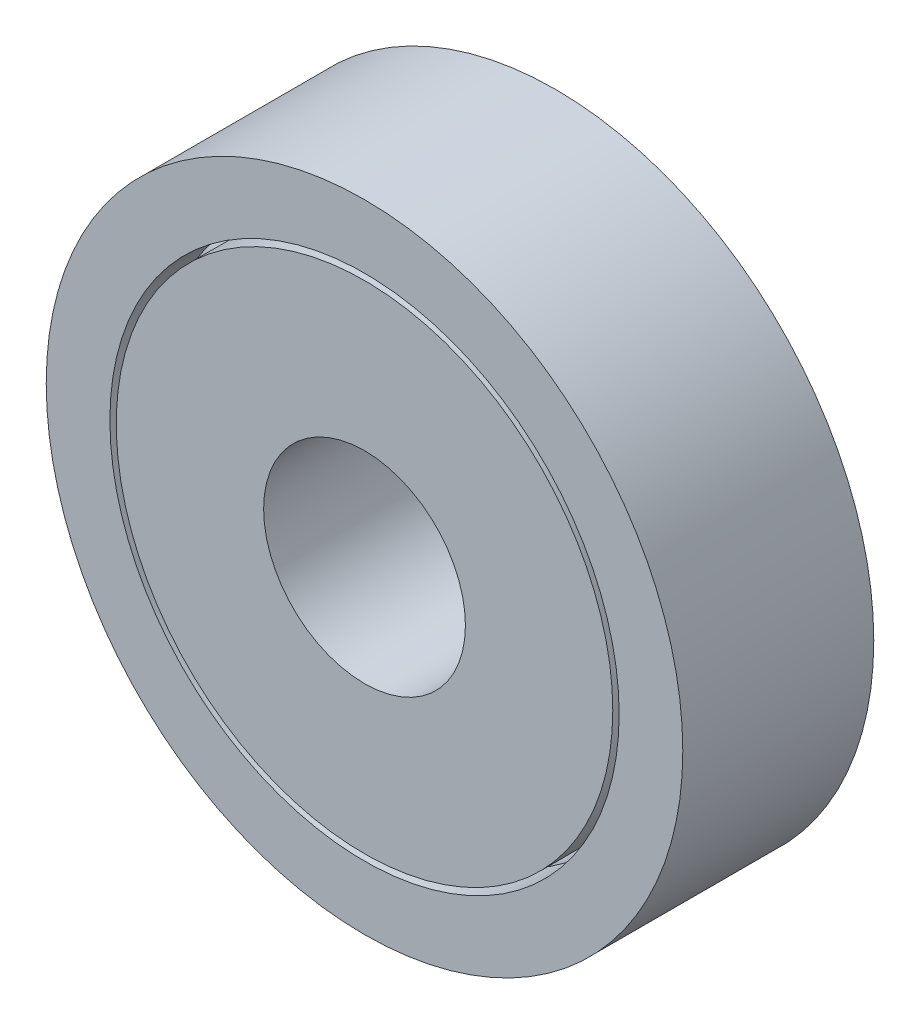
ISO-10303-21;
HEADER;
FILE_DESCRIPTION(('STEP AP214'),'2;1');
FILE_NAME('part.step','',(''),(''),'','','');
FILE_SCHEMA(('AUTOMOTIVE_DESIGN { 1 0 10303 214 1 1 1 1 }'));
ENDSEC;
DATA;
#1=APPLICATION_CONTEXT('core data for automotive mechanical design processes');
#2=APPLICATION_PROTOCOL_DEFINITION('international standard','automotive_design',2000,#1);
#3=PRODUCT_CONTEXT('',#1,'mechanical');
#4=PRODUCT('Part','Part','',(#3));
#5=PRODUCT_RELATED_PRODUCT_CATEGORY('part','',(#4));
#6=PRODUCT_DEFINITION_FORMATION('','',#4);
#7=PRODUCT_DEFINITION_CONTEXT('part definition',#1,'design');
#8=PRODUCT_DEFINITION('design','',#6,#7);
#9=PRODUCT_DEFINITION_SHAPE('','',#8);
#10=(LENGTH_UNIT() NAMED_UNIT(*) SI_UNIT(.MILLI.,.METRE.));
#11=(NAMED_UNIT(*) PLANE_ANGLE_UNIT() SI_UNIT($,.RADIAN.));
#12=(NAMED_UNIT(*) SI_UNIT($,.STERADIAN.) SOLID_ANGLE_UNIT());
#13=UNCERTAINTY_MEASURE_WITH_UNIT(LENGTH_MEASURE(1.E-05),#10,'distance_accuracy_value','');
#14=(GEOMETRIC_REPRESENTATION_CONTEXT(3) GLOBAL_UNCERTAINTY_ASSIGNED_CONTEXT((#13)) GLOBAL_UNIT_ASSIGNED_CONTEXT((#10,
#11,#12)) REPRESENTATION_CONTEXT('',''));
#15=CARTESIAN_POINT('',(0.,0.,0.));
#16=DIRECTION('',(0.,0.,1.));
#17=DIRECTION('',(1.,0.,0.));
#18=AXIS2_PLACEMENT_3D('',#15,#16,#17);
#19=CARTESIAN_POINT('',(3.72988891762,1.44496666475,1.5));
#20=DIRECTION('',(-0.645132887593961,-0.764070387689954,0.));
#21=DIRECTION('',(0.764070387689954,-0.645132887593961,0.));
#22=AXIS2_PLACEMENT_3D('',#19,#20,#21);
#23=SPHERICAL_SURFACE('',#22,0.7);
#24=CARTESIAN_POINT('',(3.27829589630423,0.910117393367032,1.5));
#25=VERTEX_POINT('',#24);
#26=VERTEX_LOOP('',#25);
#27=FACE_BOUND('',#26,.T.);
#28=ADVANCED_FACE('P0_F13',(#27),#23,.T.);
#29=CLOSED_SHELL('',(#28));
#30=MANIFOLD_SOLID_BREP('P0_B1',#29);
#31=CARTESIAN_POINT('',(0.,0.,1.5));
#32=DIRECTION('',(0.,0.,1.));
#33=DIRECTION('',(1.,0.,0.));
#34=AXIS2_PLACEMENT_3D('',#31,#32,#33);
#35=CYLINDRICAL_SURFACE('',#34,3.9);
#36=CARTESIAN_POINT('',(0.,0.,3.));
#37=DIRECTION('',(0.,0.,1.));
#38=DIRECTION('',(1.,0.,0.));
#39=AXIS2_PLACEMENT_3D('',#36,#37,#38);
#40=CIRCLE('',#39,3.9);
#41=CARTESIAN_POINT('',(3.9,0.,3.));
#42=VERTEX_POINT('',#41);
#43=EDGE_CURVE('P1_E19',#42,#42,#40,.T.);
#44=ORIENTED_EDGE('',*,*,#43,.F.);
#45=EDGE_LOOP('',(#44));
#46=FACE_BOUND('',#45,.T.);
#47=CARTESIAN_POINT('',(0.,0.,2.243303437366));
#48=DIRECTION('',(0.,0.,1.));
#49=DIRECTION('',(0.,-1.,0.));
#50=AXIS2_PLACEMENT_3D('',#47,#48,#49);
#51=CIRCLE('',#50,3.90000000000054);
#52=CARTESIAN_POINT('',(0.,-3.90000000000054,2.243303437366));
#53=VERTEX_POINT('',#52);
#54=EDGE_CURVE('P1_E31',#53,#53,#51,.T.);
#55=ORIENTED_EDGE('',*,*,#54,.T.);
#56=EDGE_LOOP('',(#55));
#57=FACE_BOUND('',#56,.T.);
#58=ADVANCED_FACE('P1_F15',(#46,#57),#35,.T.);
#59=CARTESIAN_POINT('',(0.,0.,3.));
#60=DIRECTION('',(0.,0.,1.));
#61=DIRECTION('',(1.,0.,0.));
#62=AXIS2_PLACEMENT_3D('',#59,#60,#61);
#63=PLANE('',#62);
#64=ORIENTED_EDGE('',*,*,#43,.T.);
#65=EDGE_LOOP('',(#64));
#66=FACE_BOUND('',#65,.T.);
#67=CARTESIAN_POINT('',(0.,0.,3.));
#68=DIRECTION('',(0.,0.,1.));
#69=DIRECTION('',(1.,0.,0.));
#70=AXIS2_PLACEMENT_3D('',#67,#68,#69);
#71=CIRCLE('',#70,1.585);
#72=CARTESIAN_POINT('',(1.585,0.,3.));
#73=VERTEX_POINT('',#72);
#74=EDGE_CURVE('P1_E33',#73,#73,#71,.F.);
#75=ORIENTED_EDGE('',*,*,#74,.T.);
#76=EDGE_LOOP('',(#75));
#77=FACE_BOUND('',#76,.T.);
#78=ADVANCED_FACE('P1_F44',(#66,#77),#63,.T.);
#79=CARTESIAN_POINT('',(0.,0.,1.5));
#80=DIRECTION('',(0.,0.,1.));
#81=DIRECTION('',(0.,-1.,0.));
#82=AXIS2_PLACEMENT_3D('',#79,#80,#81);
#83=TOROIDAL_SURFACE('',#82,4.,0.75);
#84=ORIENTED_EDGE('',*,*,#54,.F.);
#85=EDGE_LOOP('',(#84));
#86=FACE_BOUND('',#85,.T.);
#87=CARTESIAN_POINT('',(0.,0.,0.756696562634));
#88=DIRECTION('',(0.,0.,1.));
#89=DIRECTION('',(1.,0.,0.));
#90=AXIS2_PLACEMENT_3D('',#87,#88,#89);
#91=CIRCLE('',#90,3.9);
#92=CARTESIAN_POINT('',(3.9,0.,0.756696562634));
#93=VERTEX_POINT('',#92);
#94=EDGE_CURVE('P1_E28',#93,#93,#91,.F.);
#95=ORIENTED_EDGE('',*,*,#94,.F.);
#96=EDGE_LOOP('',(#95));
#97=FACE_BOUND('',#96,.T.);
#98=ADVANCED_FACE('P1_F17',(#86,#97),#83,.F.);
#99=CARTESIAN_POINT('',(0.,0.,1.5));
#100=DIRECTION('',(0.,0.,1.));
#101=DIRECTION('',(1.,0.,0.));
#102=AXIS2_PLACEMENT_3D('',#99,#100,#101);
#103=CYLINDRICAL_SURFACE('',#102,1.585);
#104=ORIENTED_EDGE('',*,*,#74,.F.);
#105=EDGE_LOOP('',(#104));
#106=FACE_BOUND('',#105,.T.);
#107=CARTESIAN_POINT('',(0.,0.,0.));
#108=DIRECTION('',(0.,0.,1.));
#109=DIRECTION('',(1.,0.,0.));
#110=AXIS2_PLACEMENT_3D('',#107,#108,#109);
#111=CIRCLE('',#110,1.585);
#112=CARTESIAN_POINT('',(1.585,0.,0.));
#113=VERTEX_POINT('',#112);
#114=EDGE_CURVE('P1_E23',#113,#113,#111,.F.);
#115=ORIENTED_EDGE('',*,*,#114,.T.);
#116=EDGE_LOOP('',(#115));
#117=FACE_BOUND('',#116,.T.);
#118=ADVANCED_FACE('P1_F60',(#106,#117),#103,.F.);
#119=CARTESIAN_POINT('',(0.,0.,1.5));
#120=DIRECTION('',(0.,0.,1.));
#121=DIRECTION('',(1.,0.,0.));
#122=AXIS2_PLACEMENT_3D('',#119,#120,#121);
#123=CYLINDRICAL_SURFACE('',#122,3.9);
#124=ORIENTED_EDGE('',*,*,#94,.T.);
#125=EDGE_LOOP('',(#124));
#126=FACE_BOUND('',#125,.T.);
#127=CARTESIAN_POINT('',(0.,0.,0.));
#128=DIRECTION('',(0.,0.,1.));
#129=DIRECTION('',(1.,0.,0.));
#130=AXIS2_PLACEMENT_3D('',#127,#128,#129);
#131=CIRCLE('',#130,3.9);
#132=CARTESIAN_POINT('',(3.9,0.,0.));
#133=VERTEX_POINT('',#132);
#134=EDGE_CURVE('P1_E10',#133,#133,#131,.T.);
#135=ORIENTED_EDGE('',*,*,#134,.T.);
#136=EDGE_LOOP('',(#135));
#137=FACE_BOUND('',#136,.T.);
#138=ADVANCED_FACE('P1_F54',(#126,#137),#123,.T.);
#139=CARTESIAN_POINT('',(0.,0.,0.));
#140=DIRECTION('',(0.,0.,1.));
#141=DIRECTION('',(1.,0.,0.));
#142=AXIS2_PLACEMENT_3D('',#139,#140,#141);
#143=PLANE('',#142);
#144=ORIENTED_EDGE('',*,*,#134,.F.);
#145=EDGE_LOOP('',(#144));
#146=FACE_BOUND('',#145,.T.);
#147=ORIENTED_EDGE('',*,*,#114,.F.);
#148=EDGE_LOOP('',(#147));
#149=FACE_BOUND('',#148,.T.);
#150=ADVANCED_FACE('P1_F52',(#146,#149),#143,.F.);
#151=CLOSED_SHELL('',(#58,#78,#98,#118,#138,#150));
#152=MANIFOLD_SOLID_BREP('P1_B1',#151);
#153=CARTESIAN_POINT('',(2.95603566888,-2.69478257459,1.5));
#154=DIRECTION('',(-0.971528235644877,0.23692380071397,0.));
#155=DIRECTION('',(-0.23692380071397,-0.971528235644877,0.));
#156=AXIS2_PLACEMENT_3D('',#153,#154,#155);
#157=SPHERICAL_SURFACE('',#156,0.7);
#158=CARTESIAN_POINT('',(2.27596590392859,-2.52893591409022,1.5));
#159=VERTEX_POINT('',#158);
#160=VERTEX_LOOP('',#159);
#161=FACE_BOUND('',#160,.T.);
#162=ADVANCED_FACE('P2_F13',(#161),#157,.T.);
#163=CLOSED_SHELL('',(#162));
#164=MANIFOLD_SOLID_BREP('P2_B1',#163);
#165=CARTESIAN_POINT('',(-2.41053854552,-3.19206890912,1.5));
#166=DIRECTION('',(0.146271809072995,0.989244437876966,0.));
#167=DIRECTION('',(0.989244437876966,-0.146271809072995,0.));
#168=AXIS2_PLACEMENT_3D('',#165,#166,#167);
#169=SPHERICAL_SURFACE('',#168,0.7);
#170=CARTESIAN_POINT('',(-2.3081482791689,-2.49959780260612,1.5));
#171=VERTEX_POINT('',#170);
#172=VERTEX_LOOP('',#171);
#173=FACE_BOUND('',#172,.T.);
#174=ADVANCED_FACE('P3_F13',(#173),#169,.T.);
#175=CLOSED_SHELL('',(#174));
#176=MANIFOLD_SOLID_BREP('P3_B1',#175);
#177=CARTESIAN_POINT('',(-1.09465196029,-3.84730257269,1.5));
#178=DIRECTION('',(-0.220961909098978,0.975282438438904,0.));
#179=DIRECTION('',(-0.975282438438904,-0.220961909098978,0.));
#180=AXIS2_PLACEMENT_3D('',#177,#178,#179);
#181=SPHERICAL_SURFACE('',#180,0.7);
#182=CARTESIAN_POINT('',(-1.24932529665928,-3.16460486578277,1.5));
#183=VERTEX_POINT('',#182);
#184=VERTEX_LOOP('',#183);
#185=FACE_BOUND('',#184,.T.);
#186=ADVANCED_FACE('P4_F13',(#185),#181,.T.);
#187=CLOSED_SHELL('',(#186));
#188=MANIFOLD_SOLID_BREP('P4_B1',#187);
#189=CARTESIAN_POINT('',(-3.40086854292,-2.10572865151,1.5));
#190=DIRECTION('',(0.493750708910951,0.869603494386915,0.));
#191=DIRECTION('',(-0.869603494386915,0.493750708910951,0.));
#192=AXIS2_PLACEMENT_3D('',#189,#190,#191);
#193=SPHERICAL_SURFACE('',#192,0.7);
#194=CARTESIAN_POINT('',(-3.05524304668233,-1.49700620543916,1.5));
#195=VERTEX_POINT('',#194);
#196=VERTEX_LOOP('',#195);
#197=FACE_BOUND('',#196,.T.);
#198=ADVANCED_FACE('P5_F13',(#197),#193,.T.);
#199=CLOSED_SHELL('',(#198));
#200=MANIFOLD_SOLID_BREP('P5_B1',#199);
#201=CARTESIAN_POINT('',(-1.09465196029,3.84730257269,1.5));
#202=DIRECTION('',(0.701285644943811,-0.712880385615808,0.));
#203=DIRECTION('',(-0.712880385615808,-0.701285644943811,0.));
#204=AXIS2_PLACEMENT_3D('',#201,#202,#203);
#205=SPHERICAL_SURFACE('',#204,0.7);
#206=CARTESIAN_POINT('',(-0.603752008829332,3.34828630275894,1.5));
#207=VERTEX_POINT('',#206);
#208=VERTEX_LOOP('',#207);
#209=FACE_BOUND('',#208,.T.);
#210=ADVANCED_FACE('P6_F13',(#209),#205,.T.);
#211=CLOSED_SHELL('',(#210));
#212=MANIFOLD_SOLID_BREP('P6_B1',#211);
#213=CARTESIAN_POINT('',(-3.93189239874,-0.734998071266,1.5));
#214=DIRECTION('',(0.77454583954226,0.632517780341213,0.));
#215=DIRECTION('',(0.632517780341213,-0.77454583954226,0.));
#216=AXIS2_PLACEMENT_3D('',#213,#214,#215);
#217=SPHERICAL_SURFACE('',#216,0.7);
#218=CARTESIAN_POINT('',(-3.38971031106042,-0.292235625027151,1.5));
#219=VERTEX_POINT('',#218);
#220=VERTEX_LOOP('',#219);
#221=FACE_BOUND('',#220,.T.);
#222=ADVANCED_FACE('P7_F13',(#221),#217,.T.);
#223=CLOSED_SHELL('',(#222));
#224=MANIFOLD_SOLID_BREP('P7_B1',#223);
#225=CARTESIAN_POINT('',(-3.93189239874,0.734998071266,1.5));
#226=DIRECTION('',(0.950734262637298,0.310007035158098,0.));
#227=DIRECTION('',(0.310007035158098,-0.950734262637298,0.));
#228=AXIS2_PLACEMENT_3D('',#225,#226,#227);
#229=SPHERICAL_SURFACE('',#228,0.7);
#230=CARTESIAN_POINT('',(-3.26637841489389,0.952002995876669,1.5));
#231=VERTEX_POINT('',#230);
#232=VERTEX_LOOP('',#231);
#233=FACE_BOUND('',#232,.T.);
#234=ADVANCED_FACE('P8_F13',(#233),#229,.T.);
#235=CLOSED_SHELL('',(#234));
#236=MANIFOLD_SOLID_BREP('P8_B1',#235);
#237=CARTESIAN_POINT('',(-3.40086854292,2.10572865151,1.5));
#238=DIRECTION('',(0.998520755362742,-0.0543718779316865,0.));
#239=DIRECTION('',(0.0543718779316865,0.998520755362742,0.));
#240=AXIS2_PLACEMENT_3D('',#237,#238,#239);
#241=SPHERICAL_SURFACE('',#240,0.7);
#242=CARTESIAN_POINT('',(-2.70190401416608,2.06766833695782,1.5));
#243=VERTEX_POINT('',#242);
#244=VERTEX_LOOP('',#243);
#245=FACE_BOUND('',#244,.T.);
#246=ADVANCED_FACE('P9_F13',(#245),#241,.T.);
#247=CLOSED_SHELL('',(#246));
#248=MANIFOLD_SOLID_BREP('P9_B1',#247);
#249=CARTESIAN_POINT('',(-2.41053854552,3.19206890912,1.5));
#250=DIRECTION('',(0.911451487081708,-0.411407567621869,0.));
#251=DIRECTION('',(-0.411407567621869,-0.911451487081708,0.));
#252=AXIS2_PLACEMENT_3D('',#249,#250,#251);
#253=SPHERICAL_SURFACE('',#252,0.7);
#254=CARTESIAN_POINT('',(-1.7725225045628,2.90408361178469,1.5));
#255=VERTEX_POINT('',#254);
#256=VERTEX_LOOP('',#255);
#257=FACE_BOUND('',#256,.T.);
#258=ADVANCED_FACE('P10_F13',(#257),#253,.T.);
#259=CLOSED_SHELL('',(#258));
#260=MANIFOLD_SOLID_BREP('P10_B1',#259);
#261=CARTESIAN_POINT('',(1.78295342311,-3.58065316542,1.5));
#262=DIRECTION('',(-0.820336351291799,0.57188134324286,0.));
#263=DIRECTION('',(-0.57188134324286,-0.820336351291799,0.));
#264=AXIS2_PLACEMENT_3D('',#261,#262,#263);
#265=SPHERICAL_SURFACE('',#264,0.7);
#266=CARTESIAN_POINT('',(1.20871797720574,-3.18033622515,1.5));
#267=VERTEX_POINT('',#266);
#268=VERTEX_LOOP('',#267);
#269=FACE_BOUND('',#268,.T.);
#270=ADVANCED_FACE('P11_F13',(#269),#265,.T.);
#271=CLOSED_SHELL('',(#270));
#272=MANIFOLD_SOLID_BREP('P11_B1',#271);
#273=CARTESIAN_POINT('',(4.,0.,1.5));
#274=DIRECTION('',(-0.877582561890373,-0.479425538604203,0.));
#275=DIRECTION('',(-0.479425538604203,0.877582561890373,0.));
#276=AXIS2_PLACEMENT_3D('',#273,#274,#275);
#277=SPHERICAL_SURFACE('',#276,0.700000000000001);
#278=CARTESIAN_POINT('',(3.38569220667674,-0.335597877022943,1.5));
#279=VERTEX_POINT('',#278);
#280=VERTEX_LOOP('',#279);
#281=FACE_BOUND('',#280,.T.);
#282=ADVANCED_FACE('P12_F13',(#281),#277,.T.);
#283=CLOSED_SHELL('',(#282));
#284=MANIFOLD_SOLID_BREP('P12_B1',#283);
#285=CARTESIAN_POINT('',(3.72988891762,-1.44496666475,1.5));
#286=DIRECTION('',(-0.991509848350297,-0.130031613942039,0.));
#287=DIRECTION('',(-0.130031613942039,0.991509848350297,0.));
#288=AXIS2_PLACEMENT_3D('',#285,#286,#287);
#289=SPHERICAL_SURFACE('',#288,0.7);
#290=CARTESIAN_POINT('',(3.03583202377479,-1.53598879450943,1.5));
#291=VERTEX_POINT('',#290);
#292=VERTEX_LOOP('',#291);
#293=FACE_BOUND('',#292,.T.);
#294=ADVANCED_FACE('P13_F13',(#293),#289,.T.);
#295=CLOSED_SHELL('',(#294));
#296=MANIFOLD_SOLID_BREP('P13_B1',#295);
#297=CARTESIAN_POINT('',(2.95603566888,2.69478257459,1.5));
#298=DIRECTION('',(-0.32555444202384,-0.945523297057532,0.));
#299=DIRECTION('',(0.945523297057532,-0.32555444202384,0.));
#300=AXIS2_PLACEMENT_3D('',#297,#298,#299);
#301=SPHERICAL_SURFACE('',#300,0.7);
#302=CARTESIAN_POINT('',(2.72814755946331,2.03291626664973,1.5));
#303=VERTEX_POINT('',#302);
#304=VERTEX_LOOP('',#303);
#305=FACE_BOUND('',#304,.T.);
#306=ADVANCED_FACE('P14_F13',(#305),#301,.T.);
#307=CLOSED_SHELL('',(#306));
#308=MANIFOLD_SOLID_BREP('P14_B1',#307);
#309=CARTESIAN_POINT('',(0.369073437853,3.98293670518,1.5));
#310=DIRECTION('',(0.396407290497803,-0.918074757326543,0.));
#311=DIRECTION('',(-0.918074757326543,-0.396407290497803,0.));
#312=AXIS2_PLACEMENT_3D('',#309,#310,#311);
#313=SPHERICAL_SURFACE('',#312,0.7);
#314=CARTESIAN_POINT('',(0.646558541201462,3.34028437505142,1.5));
#315=VERTEX_POINT('',#314);
#316=VERTEX_LOOP('',#315);
#317=FACE_BOUND('',#316,.T.);
#318=ADVANCED_FACE('P15_F13',(#317),#313,.T.);
#319=CLOSED_SHELL('',(#318));
#320=MANIFOLD_SOLID_BREP('P15_B1',#319);
#321=CARTESIAN_POINT('',(0.,0.,1.5));
#322=DIRECTION('',(0.,0.,1.));
#323=DIRECTION('',(0.,-1.,0.));
#324=AXIS2_PLACEMENT_3D('',#321,#322,#323);
#325=TOROIDAL_SURFACE('',#324,4.,0.75);
#326=CARTESIAN_POINT('',(0.,0.,0.75));
#327=DIRECTION('',(0.,0.,1.));
#328=DIRECTION('',(1.,0.,0.));
#329=AXIS2_PLACEMENT_3D('',#326,#327,#328);
#330=CIRCLE('',#329,4.);
#331=CARTESIAN_POINT('',(4.,0.,0.75));
#332=VERTEX_POINT('',#331);
#333=EDGE_CURVE('P16_E30',#332,#332,#330,.F.);
#334=ORIENTED_EDGE('',*,*,#333,.T.);
#335=EDGE_LOOP('',(#334));
#336=FACE_BOUND('',#335,.T.);
#337=CARTESIAN_POINT('',(0.,0.,2.25));
#338=DIRECTION('',(0.,0.,1.));
#339=DIRECTION('',(1.,0.,0.));
#340=AXIS2_PLACEMENT_3D('',#337,#338,#339);
#341=CIRCLE('',#340,4.);
#342=CARTESIAN_POINT('',(4.,0.,2.25));
#343=VERTEX_POINT('',#342);
#344=EDGE_CURVE('P16_E36',#343,#343,#341,.T.);
#345=ORIENTED_EDGE('',*,*,#344,.T.);
#346=EDGE_LOOP('',(#345));
#347=FACE_BOUND('',#346,.T.);
#348=ADVANCED_FACE('P16_F15',(#336,#347),#325,.F.);
#349=CARTESIAN_POINT('',(0.,0.,1.5));
#350=DIRECTION('',(0.,0.,1.));
#351=DIRECTION('',(1.,0.,0.));
#352=AXIS2_PLACEMENT_3D('',#349,#350,#351);
#353=CYLINDRICAL_SURFACE('',#352,4.);
#354=ORIENTED_EDGE('',*,*,#333,.F.);
#355=EDGE_LOOP('',(#354));
#356=FACE_BOUND('',#355,.T.);
#357=CARTESIAN_POINT('',(0.,0.,0.));
#358=DIRECTION('',(0.,0.,1.));
#359=DIRECTION('',(1.,0.,0.));
#360=AXIS2_PLACEMENT_3D('',#357,#358,#359);
#361=CIRCLE('',#360,4.);
#362=CARTESIAN_POINT('',(4.,0.,0.));
#363=VERTEX_POINT('',#362);
#364=EDGE_CURVE('P16_E18',#363,#363,#361,.F.);
#365=ORIENTED_EDGE('',*,*,#364,.T.);
#366=EDGE_LOOP('',(#365));
#367=FACE_BOUND('',#366,.T.);
#368=ADVANCED_FACE('P16_F46',(#356,#367),#353,.F.);
#369=CARTESIAN_POINT('',(0.,0.,1.5));
#370=DIRECTION('',(0.,0.,1.));
#371=DIRECTION('',(1.,0.,0.));
#372=AXIS2_PLACEMENT_3D('',#369,#370,#371);
#373=CYLINDRICAL_SURFACE('',#372,4.);
#374=ORIENTED_EDGE('',*,*,#344,.F.);
#375=EDGE_LOOP('',(#374));
#376=FACE_BOUND('',#375,.T.);
#377=CARTESIAN_POINT('',(0.,0.,3.));
#378=DIRECTION('',(0.,0.,1.));
#379=DIRECTION('',(1.,0.,0.));
#380=AXIS2_PLACEMENT_3D('',#377,#378,#379);
#381=CIRCLE('',#380,4.);
#382=CARTESIAN_POINT('',(4.,0.,3.));
#383=VERTEX_POINT('',#382);
#384=EDGE_CURVE('P16_E27',#383,#383,#381,.F.);
#385=ORIENTED_EDGE('',*,*,#384,.F.);
#386=EDGE_LOOP('',(#385));
#387=FACE_BOUND('',#386,.T.);
#388=ADVANCED_FACE('P16_F48',(#376,#387),#373,.F.);
#389=CARTESIAN_POINT('',(0.,0.,0.));
#390=DIRECTION('',(0.,0.,1.));
#391=DIRECTION('',(1.,0.,0.));
#392=AXIS2_PLACEMENT_3D('',#389,#390,#391);
#393=PLANE('',#392);
#394=CARTESIAN_POINT('',(0.,0.,0.));
#395=DIRECTION('',(0.,0.,1.));
#396=DIRECTION('',(1.,0.,0.));
#397=AXIS2_PLACEMENT_3D('',#394,#395,#396);
#398=CIRCLE('',#397,5.);
#399=CARTESIAN_POINT('',(5.,0.,0.));
#400=VERTEX_POINT('',#399);
#401=EDGE_CURVE('P16_E22',#400,#400,#398,.T.);
#402=ORIENTED_EDGE('',*,*,#401,.F.);
#403=EDGE_LOOP('',(#402));
#404=FACE_BOUND('',#403,.T.);
#405=ORIENTED_EDGE('',*,*,#364,.F.);
#406=EDGE_LOOP('',(#405));
#407=FACE_BOUND('',#406,.T.);
#408=ADVANCED_FACE('P16_F54',(#404,#407),#393,.F.);
#409=CARTESIAN_POINT('',(0.,0.,3.));
#410=DIRECTION('',(0.,0.,1.));
#411=DIRECTION('',(1.,0.,0.));
#412=AXIS2_PLACEMENT_3D('',#409,#410,#411);
#413=PLANE('',#412);
#414=CARTESIAN_POINT('',(0.,0.,3.));
#415=DIRECTION('',(0.,0.,1.));
#416=DIRECTION('',(1.,0.,0.));
#417=AXIS2_PLACEMENT_3D('',#414,#415,#416);
#418=CIRCLE('',#417,5.);
#419=CARTESIAN_POINT('',(5.,0.,3.));
#420=VERTEX_POINT('',#419);
#421=EDGE_CURVE('P16_E10',#420,#420,#418,.F.);
#422=ORIENTED_EDGE('',*,*,#421,.F.);
#423=EDGE_LOOP('',(#422));
#424=FACE_BOUND('',#423,.T.);
#425=ORIENTED_EDGE('',*,*,#384,.T.);
#426=EDGE_LOOP('',(#425));
#427=FACE_BOUND('',#426,.T.);
#428=ADVANCED_FACE('P16_F59',(#424,#427),#413,.T.);
#429=CARTESIAN_POINT('',(0.,0.,1.5));
#430=DIRECTION('',(0.,0.,1.));
#431=DIRECTION('',(1.,0.,0.));
#432=AXIS2_PLACEMENT_3D('',#429,#430,#431);
#433=CYLINDRICAL_SURFACE('',#432,5.);
#434=ORIENTED_EDGE('',*,*,#421,.T.);
#435=EDGE_LOOP('',(#434));
#436=FACE_BOUND('',#435,.T.);
#437=ORIENTED_EDGE('',*,*,#401,.T.);
#438=EDGE_LOOP('',(#437));
#439=FACE_BOUND('',#438,.T.);
#440=ADVANCED_FACE('P16_F57',(#436,#439),#433,.T.);
#441=CLOSED_SHELL('',(#348,#368,#388,#408,#428,#440));
#442=MANIFOLD_SOLID_BREP('P16_B1',#441);
#443=CARTESIAN_POINT('',(1.78295342311,3.58065316542,1.5));
#444=DIRECTION('',(0.0379919349014117,-0.999278045832313,0.));
#445=DIRECTION('',(0.999278045832313,0.0379919349014116,0.));
#446=AXIS2_PLACEMENT_3D('',#443,#444,#445);
#447=SPHERICAL_SURFACE('',#446,0.7);
#448=CARTESIAN_POINT('',(1.80954777754099,2.88115853333738,1.5));
#449=VERTEX_POINT('',#448);
#450=VERTEX_LOOP('',#449);
#451=FACE_BOUND('',#450,.T.);
#452=ADVANCED_FACE('P17_F13',(#451),#447,.T.);
#453=CLOSED_SHELL('',(#452));
#454=MANIFOLD_SOLID_BREP('P17_B1',#453);
#455=CARTESIAN_POINT('',(0.369073437853,-3.98293670518,1.5));
#456=DIRECTION('',(-0.558353497056016,0.829603141463024,0.));
#457=DIRECTION('',(0.829603141463024,0.558353497056016,0.));
#458=AXIS2_PLACEMENT_3D('',#455,#456,#457);
#459=SPHERICAL_SURFACE('',#458,0.700000000000001);
#460=CARTESIAN_POINT('',(-0.0217740100862117,-3.40221450615588,1.5));
#461=VERTEX_POINT('',#460);
#462=VERTEX_LOOP('',#461);
#463=FACE_BOUND('',#462,.T.);
#464=ADVANCED_FACE('P18_F13',(#463),#459,.T.);
#465=CLOSED_SHELL('',(#464));
#466=MANIFOLD_SOLID_BREP('P18_B1',#465);
#467=ADVANCED_BREP_SHAPE_REPRESENTATION('',(#18,#30,#152,#164,#176,#188,#200,#212,#224,#236,
#248,#260,#272,#284,#296,#308,#320,#442,#454,#466),#14);
#468=SHAPE_DEFINITION_REPRESENTATION(#9,#467);
ENDSEC;
END-ISO-10303-21;
